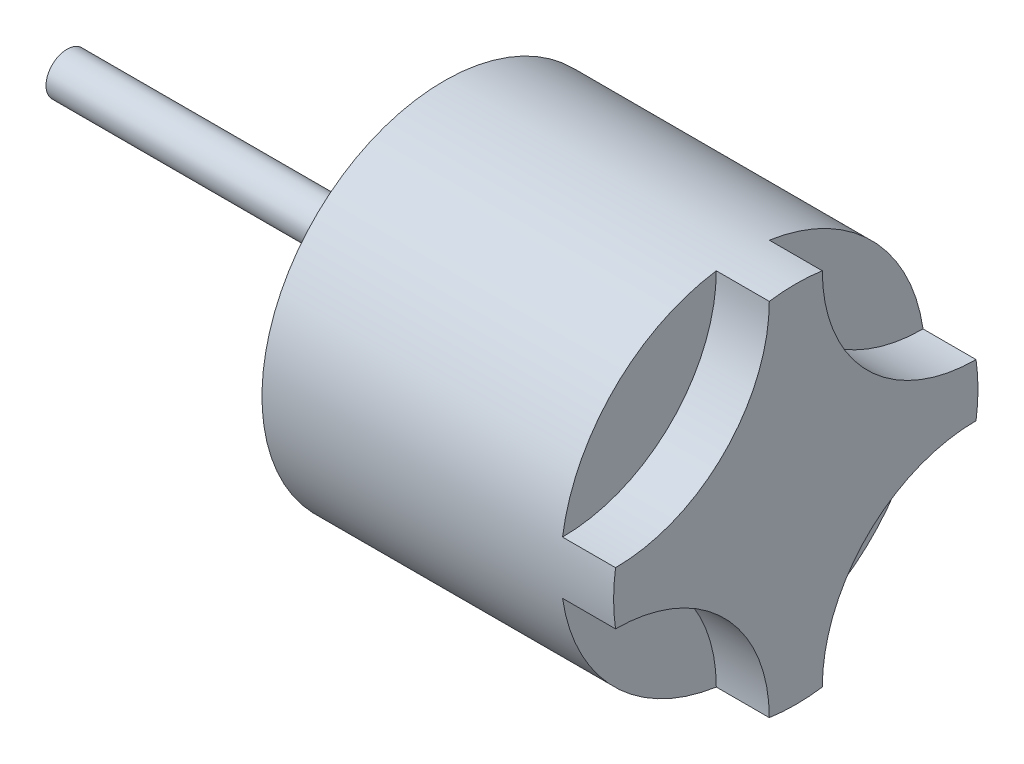
ISO-10303-21;
HEADER;
FILE_DESCRIPTION(('STEP AP214'),'2;1');
FILE_NAME('part.step','',(''),(''),'','','');
FILE_SCHEMA(('AUTOMOTIVE_DESIGN { 1 0 10303 214 1 1 1 1 }'));
ENDSEC;
DATA;
#1=APPLICATION_CONTEXT('core data for automotive mechanical design processes');
#2=APPLICATION_PROTOCOL_DEFINITION('international standard','automotive_design',2000,#1);
#3=PRODUCT_CONTEXT('',#1,'mechanical');
#4=PRODUCT('Part','Part','',(#3));
#5=PRODUCT_RELATED_PRODUCT_CATEGORY('part','',(#4));
#6=PRODUCT_DEFINITION_FORMATION('','',#4);
#7=PRODUCT_DEFINITION_CONTEXT('part definition',#1,'design');
#8=PRODUCT_DEFINITION('design','',#6,#7);
#9=PRODUCT_DEFINITION_SHAPE('','',#8);
#10=(LENGTH_UNIT() NAMED_UNIT(*) SI_UNIT(.MILLI.,.METRE.));
#11=(NAMED_UNIT(*) PLANE_ANGLE_UNIT() SI_UNIT($,.RADIAN.));
#12=(NAMED_UNIT(*) SI_UNIT($,.STERADIAN.) SOLID_ANGLE_UNIT());
#13=UNCERTAINTY_MEASURE_WITH_UNIT(LENGTH_MEASURE(1.E-05),#10,'distance_accuracy_value','');
#14=(GEOMETRIC_REPRESENTATION_CONTEXT(3) GLOBAL_UNCERTAINTY_ASSIGNED_CONTEXT((#13)) GLOBAL_UNIT_ASSIGNED_CONTEXT((#10,
#11,#12)) REPRESENTATION_CONTEXT('',''));
#15=CARTESIAN_POINT('',(0.,0.,0.));
#16=DIRECTION('',(0.,0.,1.));
#17=DIRECTION('',(1.,0.,0.));
#18=AXIS2_PLACEMENT_3D('',#15,#16,#17);
#19=CARTESIAN_POINT('',(30.,0.,0.));
#20=DIRECTION('',(-1.,0.,0.));
#21=DIRECTION('',(0.,0.,1.));
#22=AXIS2_PLACEMENT_3D('',#19,#20,#21);
#23=CYLINDRICAL_SURFACE('',#22,13.75);
#24=CARTESIAN_POINT('',(3.46410161513776,0.,0.));
#25=DIRECTION('',(1.,0.,0.));
#26=DIRECTION('',(0.,0.,-1.));
#27=AXIS2_PLACEMENT_3D('',#24,#25,#26);
#28=CIRCLE('',#27,13.75);
#29=CARTESIAN_POINT('',(3.46410161513776,0.,-13.75));
#30=VERTEX_POINT('',#29);
#31=EDGE_CURVE('E41',#30,#30,#28,.T.);
#32=ORIENTED_EDGE('',*,*,#31,.T.);
#33=EDGE_LOOP('',(#32));
#34=FACE_BOUND('',#33,.T.);
#35=DIRECTION('',(1.,0.,0.));
#36=VECTOR('',#35,1.);
#37=CARTESIAN_POINT('',(26.,-2.,13.6037678604128));
#38=LINE('',#37,#36);
#39=CARTESIAN_POINT('',(26.,-2.,13.6037678604128));
#40=VERTEX_POINT('',#39);
#41=CARTESIAN_POINT('',(30.,-2.,13.6037678604128));
#42=VERTEX_POINT('',#41);
#43=EDGE_CURVE('E102',#40,#42,#38,.T.);
#44=ORIENTED_EDGE('',*,*,#43,.T.);
#45=CARTESIAN_POINT('',(30.,0.,0.));
#46=DIRECTION('',(1.,0.,0.));
#47=DIRECTION('',(0.,0.,-1.));
#48=AXIS2_PLACEMENT_3D('',#45,#46,#47);
#49=CIRCLE('',#48,13.75);
#50=CARTESIAN_POINT('',(30.,2.,13.6037678604128));
#51=VERTEX_POINT('',#50);
#52=EDGE_CURVE('E158',#51,#42,#49,.T.);
#53=ORIENTED_EDGE('',*,*,#52,.F.);
#54=DIRECTION('',(1.,0.,0.));
#55=VECTOR('',#54,1.);
#56=CARTESIAN_POINT('',(26.,2.,13.6037678604128));
#57=LINE('',#56,#55);
#58=CARTESIAN_POINT('',(26.,2.,13.6037678604128));
#59=VERTEX_POINT('',#58);
#60=EDGE_CURVE('E147',#59,#51,#57,.T.);
#61=ORIENTED_EDGE('',*,*,#60,.F.);
#62=CARTESIAN_POINT('',(26.,0.,0.));
#63=DIRECTION('',(1.,0.,0.));
#64=DIRECTION('',(0.,0.,-1.));
#65=AXIS2_PLACEMENT_3D('',#62,#63,#64);
#66=CIRCLE('',#65,13.75);
#67=CARTESIAN_POINT('',(26.,13.6037678604128,2.));
#68=VERTEX_POINT('',#67);
#69=EDGE_CURVE('E142',#68,#59,#66,.T.);
#70=ORIENTED_EDGE('',*,*,#69,.F.);
#71=DIRECTION('',(1.,0.,0.));
#72=VECTOR('',#71,1.);
#73=CARTESIAN_POINT('',(26.,13.6037678604128,2.));
#74=LINE('',#73,#72);
#75=CARTESIAN_POINT('',(30.,13.6037678604128,2.));
#76=VERTEX_POINT('',#75);
#77=EDGE_CURVE('E150',#68,#76,#74,.T.);
#78=ORIENTED_EDGE('',*,*,#77,.T.);
#79=CARTESIAN_POINT('',(30.,13.6037678604128,-2.));
#80=VERTEX_POINT('',#79);
#81=EDGE_CURVE('E157',#80,#76,#49,.T.);
#82=ORIENTED_EDGE('',*,*,#81,.F.);
#83=DIRECTION('',(1.,0.,0.));
#84=VECTOR('',#83,1.);
#85=CARTESIAN_POINT('',(26.,13.6037678604128,-2.));
#86=LINE('',#85,#84);
#87=CARTESIAN_POINT('',(26.,13.6037678604128,-2.));
#88=VERTEX_POINT('',#87);
#89=EDGE_CURVE('E134',#88,#80,#86,.T.);
#90=ORIENTED_EDGE('',*,*,#89,.F.);
#91=CARTESIAN_POINT('',(26.,0.,0.));
#92=DIRECTION('',(-1.,0.,0.));
#93=DIRECTION('',(0.,0.,1.));
#94=AXIS2_PLACEMENT_3D('',#91,#92,#93);
#95=CIRCLE('',#94,13.75);
#96=CARTESIAN_POINT('',(26.,2.,-13.6037678604128));
#97=VERTEX_POINT('',#96);
#98=EDGE_CURVE('E129',#88,#97,#95,.T.);
#99=ORIENTED_EDGE('',*,*,#98,.T.);
#100=DIRECTION('',(1.,0.,0.));
#101=VECTOR('',#100,1.);
#102=CARTESIAN_POINT('',(26.,2.,-13.6037678604128));
#103=LINE('',#102,#101);
#104=CARTESIAN_POINT('',(30.,2.,-13.6037678604128));
#105=VERTEX_POINT('',#104);
#106=EDGE_CURVE('E137',#97,#105,#103,.T.);
#107=ORIENTED_EDGE('',*,*,#106,.T.);
#108=CARTESIAN_POINT('',(30.,-2.,-13.6037678604128));
#109=VERTEX_POINT('',#108);
#110=EDGE_CURVE('E300',#109,#105,#49,.T.);
#111=ORIENTED_EDGE('',*,*,#110,.F.);
#112=DIRECTION('',(1.,0.,0.));
#113=VECTOR('',#112,1.);
#114=CARTESIAN_POINT('',(26.,-2.,-13.6037678604128));
#115=LINE('',#114,#113);
#116=CARTESIAN_POINT('',(26.,-2.,-13.6037678604128));
#117=VERTEX_POINT('',#116);
#118=EDGE_CURVE('E56',#117,#109,#115,.T.);
#119=ORIENTED_EDGE('',*,*,#118,.F.);
#120=CARTESIAN_POINT('',(26.,0.,0.));
#121=DIRECTION('',(1.,0.,0.));
#122=DIRECTION('',(0.,0.,1.));
#123=AXIS2_PLACEMENT_3D('',#120,#121,#122);
#124=CIRCLE('',#123,13.75);
#125=CARTESIAN_POINT('',(26.,-13.6037678604128,-2.));
#126=VERTEX_POINT('',#125);
#127=EDGE_CURVE('E119',#126,#117,#124,.T.);
#128=ORIENTED_EDGE('',*,*,#127,.F.);
#129=DIRECTION('',(1.,0.,0.));
#130=VECTOR('',#129,1.);
#131=CARTESIAN_POINT('',(26.,-13.6037678604128,-2.));
#132=LINE('',#131,#130);
#133=CARTESIAN_POINT('',(30.,-13.6037678604128,-2.));
#134=VERTEX_POINT('',#133);
#135=EDGE_CURVE('E125',#126,#134,#132,.T.);
#136=ORIENTED_EDGE('',*,*,#135,.T.);
#137=CARTESIAN_POINT('',(30.,-13.6037678604128,2.));
#138=VERTEX_POINT('',#137);
#139=EDGE_CURVE('E113',#138,#134,#49,.T.);
#140=ORIENTED_EDGE('',*,*,#139,.F.);
#141=DIRECTION('',(1.,0.,0.));
#142=VECTOR('',#141,1.);
#143=CARTESIAN_POINT('',(26.,-13.6037678604128,2.));
#144=LINE('',#143,#142);
#145=CARTESIAN_POINT('',(26.,-13.6037678604128,2.));
#146=VERTEX_POINT('',#145);
#147=EDGE_CURVE('E48',#146,#138,#144,.T.);
#148=ORIENTED_EDGE('',*,*,#147,.F.);
#149=CARTESIAN_POINT('',(26.,0.,0.));
#150=DIRECTION('',(-1.,0.,0.));
#151=DIRECTION('',(0.,0.,-1.));
#152=AXIS2_PLACEMENT_3D('',#149,#150,#151);
#153=CIRCLE('',#152,13.75);
#154=EDGE_CURVE('E105',#146,#40,#153,.T.);
#155=ORIENTED_EDGE('',*,*,#154,.T.);
#156=EDGE_LOOP('',(#44,#53,#61,#70,#78,#82,#90,#99,#107,#111,#119,#128,#136,#140,#148,#155));
#157=FACE_BOUND('',#156,.T.);
#158=ADVANCED_FACE('F33',(#34,#157),#23,.T.);
#159=CARTESIAN_POINT('',(30.,0.,0.));
#160=DIRECTION('',(1.,0.,0.));
#161=DIRECTION('',(0.,0.,-1.));
#162=AXIS2_PLACEMENT_3D('',#159,#160,#161);
#163=PLANE('',#162);
#164=ORIENTED_EDGE('',*,*,#52,.T.);
#165=CARTESIAN_POINT('',(30.,-13.6037678604128,13.6037678604128));
#166=DIRECTION('',(-1.,0.,0.));
#167=DIRECTION('',(0.,0.,1.));
#168=AXIS2_PLACEMENT_3D('',#165,#166,#167);
#169=CIRCLE('',#168,11.6037678604128);
#170=EDGE_CURVE('E109',#42,#138,#169,.T.);
#171=ORIENTED_EDGE('',*,*,#170,.T.);
#172=ORIENTED_EDGE('',*,*,#139,.T.);
#173=CARTESIAN_POINT('',(30.,-13.6037678604128,-13.6037678604128));
#174=DIRECTION('',(1.,0.,0.));
#175=DIRECTION('',(0.,0.,-1.));
#176=AXIS2_PLACEMENT_3D('',#173,#174,#175);
#177=CIRCLE('',#176,11.6037678604128);
#178=EDGE_CURVE('E115',#109,#134,#177,.T.);
#179=ORIENTED_EDGE('',*,*,#178,.F.);
#180=ORIENTED_EDGE('',*,*,#110,.T.);
#181=CARTESIAN_POINT('',(30.,13.6037678604128,-13.6037678604128));
#182=DIRECTION('',(-1.,0.,0.));
#183=DIRECTION('',(0.,0.,-1.));
#184=AXIS2_PLACEMENT_3D('',#181,#182,#183);
#185=CIRCLE('',#184,11.6037678604128);
#186=EDGE_CURVE('E127',#105,#80,#185,.T.);
#187=ORIENTED_EDGE('',*,*,#186,.T.);
#188=ORIENTED_EDGE('',*,*,#81,.T.);
#189=CARTESIAN_POINT('',(30.,13.6037678604128,13.6037678604128));
#190=DIRECTION('',(1.,0.,0.));
#191=DIRECTION('',(0.,0.,1.));
#192=AXIS2_PLACEMENT_3D('',#189,#190,#191);
#193=CIRCLE('',#192,11.6037678604128);
#194=EDGE_CURVE('E140',#51,#76,#193,.T.);
#195=ORIENTED_EDGE('',*,*,#194,.F.);
#196=EDGE_LOOP('',(#164,#171,#172,#179,#180,#187,#188,#195));
#197=FACE_BOUND('',#196,.T.);
#198=ADVANCED_FACE('F183',(#197),#163,.T.);
#199=CARTESIAN_POINT('',(0.,0.,0.));
#200=DIRECTION('',(1.,0.,0.));
#201=DIRECTION('',(0.,0.,-1.));
#202=AXIS2_PLACEMENT_3D('',#199,#200,#201);
#203=PLANE('',#202);
#204=CARTESIAN_POINT('',(0.,0.,0.));
#205=DIRECTION('',(1.,0.,0.));
#206=DIRECTION('',(0.,0.,-1.));
#207=AXIS2_PLACEMENT_3D('',#204,#205,#206);
#208=CIRCLE('',#207,7.74999999999996);
#209=CARTESIAN_POINT('',(0.,0.,-7.74999999999996));
#210=VERTEX_POINT('',#209);
#211=EDGE_CURVE('E11',#210,#210,#208,.F.);
#212=ORIENTED_EDGE('',*,*,#211,.T.);
#213=EDGE_LOOP('',(#212));
#214=FACE_BOUND('',#213,.T.);
#215=CARTESIAN_POINT('',(0.,0.,0.));
#216=DIRECTION('',(1.,0.,0.));
#217=DIRECTION('',(0.,0.,-1.));
#218=AXIS2_PLACEMENT_3D('',#215,#216,#217);
#219=CIRCLE('',#218,1.585);
#220=CARTESIAN_POINT('',(0.,0.,-1.585));
#221=VERTEX_POINT('',#220);
#222=EDGE_CURVE('E161',#221,#221,#219,.F.);
#223=ORIENTED_EDGE('',*,*,#222,.F.);
#224=EDGE_LOOP('',(#223));
#225=FACE_BOUND('',#224,.T.);
#226=ADVANCED_FACE('F187',(#214,#225),#203,.F.);
#227=CARTESIAN_POINT('',(-25.,0.,0.));
#228=DIRECTION('',(1.,0.,0.));
#229=DIRECTION('',(0.,0.,-1.));
#230=AXIS2_PLACEMENT_3D('',#227,#228,#229);
#231=CYLINDRICAL_SURFACE('',#230,1.585);
#232=CARTESIAN_POINT('',(-25.,0.,0.));
#233=DIRECTION('',(-1.,0.,0.));
#234=DIRECTION('',(0.,0.,1.));
#235=AXIS2_PLACEMENT_3D('',#232,#233,#234);
#236=CIRCLE('',#235,1.585);
#237=CARTESIAN_POINT('',(-25.,0.,1.585));
#238=VERTEX_POINT('',#237);
#239=EDGE_CURVE('E153',#238,#238,#236,.T.);
#240=ORIENTED_EDGE('',*,*,#239,.F.);
#241=EDGE_LOOP('',(#240));
#242=FACE_BOUND('',#241,.T.);
#243=ORIENTED_EDGE('',*,*,#222,.T.);
#244=EDGE_LOOP('',(#243));
#245=FACE_BOUND('',#244,.T.);
#246=ADVANCED_FACE('F178',(#242,#245),#231,.T.);
#247=CARTESIAN_POINT('',(-25.,0.,0.));
#248=DIRECTION('',(-1.,0.,0.));
#249=DIRECTION('',(0.,0.,1.));
#250=AXIS2_PLACEMENT_3D('',#247,#248,#249);
#251=PLANE('',#250);
#252=ORIENTED_EDGE('',*,*,#239,.T.);
#253=EDGE_LOOP('',(#252));
#254=FACE_BOUND('',#253,.T.);
#255=ADVANCED_FACE('F169',(#254),#251,.T.);
#256=CARTESIAN_POINT('',(3.46410161513776,0.,0.));
#257=DIRECTION('',(1.,0.,0.));
#258=DIRECTION('',(0.,0.,-1.));
#259=AXIS2_PLACEMENT_3D('',#256,#257,#258);
#260=CONICAL_SURFACE('',#259,13.75,1.0471975511966);
#261=ORIENTED_EDGE('',*,*,#211,.F.);
#262=EDGE_LOOP('',(#261));
#263=FACE_BOUND('',#262,.T.);
#264=ORIENTED_EDGE('',*,*,#31,.F.);
#265=EDGE_LOOP('',(#264));
#266=FACE_BOUND('',#265,.T.);
#267=ADVANCED_FACE('F35',(#263,#266),#260,.T.);
#268=CARTESIAN_POINT('',(26.,13.6037678604128,13.6037678604128));
#269=DIRECTION('',(1.,0.,0.));
#270=DIRECTION('',(0.,0.,-1.));
#271=AXIS2_PLACEMENT_3D('',#268,#269,#270);
#272=CYLINDRICAL_SURFACE('',#271,11.6037678604128);
#273=ORIENTED_EDGE('',*,*,#194,.T.);
#274=ORIENTED_EDGE('',*,*,#77,.F.);
#275=CARTESIAN_POINT('',(26.,13.6037678604128,13.6037678604128));
#276=DIRECTION('',(1.,0.,0.));
#277=DIRECTION('',(0.,0.,1.));
#278=AXIS2_PLACEMENT_3D('',#275,#276,#277);
#279=CIRCLE('',#278,11.6037678604128);
#280=EDGE_CURVE('E144',#59,#68,#279,.T.);
#281=ORIENTED_EDGE('',*,*,#280,.F.);
#282=ORIENTED_EDGE('',*,*,#60,.T.);
#283=EDGE_LOOP('',(#273,#274,#281,#282));
#284=FACE_BOUND('',#283,.T.);
#285=ADVANCED_FACE('F168',(#284),#272,.F.);
#286=CARTESIAN_POINT('',(26.,6.8018839302064,6.8018839302064));
#287=DIRECTION('',(1.,0.,0.));
#288=DIRECTION('',(0.,0.,-1.));
#289=AXIS2_PLACEMENT_3D('',#286,#287,#288);
#290=PLANE('',#289);
#291=ORIENTED_EDGE('',*,*,#69,.T.);
#292=ORIENTED_EDGE('',*,*,#280,.T.);
#293=EDGE_LOOP('',(#291,#292));
#294=FACE_BOUND('',#293,.T.);
#295=ADVANCED_FACE('F175',(#294),#290,.T.);
#296=CARTESIAN_POINT('',(26.,13.6037678604128,-13.6037678604128));
#297=DIRECTION('',(1.,0.,0.));
#298=DIRECTION('',(0.,0.,-1.));
#299=AXIS2_PLACEMENT_3D('',#296,#297,#298);
#300=CYLINDRICAL_SURFACE('',#299,11.6037678604128);
#301=ORIENTED_EDGE('',*,*,#186,.F.);
#302=ORIENTED_EDGE('',*,*,#106,.F.);
#303=CARTESIAN_POINT('',(26.,13.6037678604128,-13.6037678604128));
#304=DIRECTION('',(-1.,0.,0.));
#305=DIRECTION('',(0.,0.,-1.));
#306=AXIS2_PLACEMENT_3D('',#303,#304,#305);
#307=CIRCLE('',#306,11.6037678604128);
#308=EDGE_CURVE('E132',#97,#88,#307,.T.);
#309=ORIENTED_EDGE('',*,*,#308,.T.);
#310=ORIENTED_EDGE('',*,*,#89,.T.);
#311=EDGE_LOOP('',(#301,#302,#309,#310));
#312=FACE_BOUND('',#311,.T.);
#313=ADVANCED_FACE('F199',(#312),#300,.F.);
#314=CARTESIAN_POINT('',(26.,6.8018839302064,-6.8018839302064));
#315=DIRECTION('',(1.,0.,0.));
#316=DIRECTION('',(0.,0.,1.));
#317=AXIS2_PLACEMENT_3D('',#314,#315,#316);
#318=PLANE('',#317);
#319=ORIENTED_EDGE('',*,*,#98,.F.);
#320=ORIENTED_EDGE('',*,*,#308,.F.);
#321=EDGE_LOOP('',(#319,#320));
#322=FACE_BOUND('',#321,.T.);
#323=ADVANCED_FACE('F203',(#322),#318,.T.);
#324=CARTESIAN_POINT('',(26.,-13.6037678604128,-13.6037678604128));
#325=DIRECTION('',(1.,0.,0.));
#326=DIRECTION('',(0.,0.,-1.));
#327=AXIS2_PLACEMENT_3D('',#324,#325,#326);
#328=CYLINDRICAL_SURFACE('',#327,11.6037678604128);
#329=ORIENTED_EDGE('',*,*,#178,.T.);
#330=ORIENTED_EDGE('',*,*,#135,.F.);
#331=CARTESIAN_POINT('',(26.,-13.6037678604128,-13.6037678604128));
#332=DIRECTION('',(1.,0.,0.));
#333=DIRECTION('',(0.,0.,-1.));
#334=AXIS2_PLACEMENT_3D('',#331,#332,#333);
#335=CIRCLE('',#334,11.6037678604128);
#336=EDGE_CURVE('E121',#117,#126,#335,.T.);
#337=ORIENTED_EDGE('',*,*,#336,.F.);
#338=ORIENTED_EDGE('',*,*,#118,.T.);
#339=EDGE_LOOP('',(#329,#330,#337,#338));
#340=FACE_BOUND('',#339,.T.);
#341=ADVANCED_FACE('F207',(#340),#328,.F.);
#342=CARTESIAN_POINT('',(26.,-6.8018839302064,-6.8018839302064));
#343=DIRECTION('',(1.,0.,0.));
#344=DIRECTION('',(0.,0.,1.));
#345=AXIS2_PLACEMENT_3D('',#342,#343,#344);
#346=PLANE('',#345);
#347=ORIENTED_EDGE('',*,*,#127,.T.);
#348=ORIENTED_EDGE('',*,*,#336,.T.);
#349=EDGE_LOOP('',(#347,#348));
#350=FACE_BOUND('',#349,.T.);
#351=ADVANCED_FACE('F211',(#350),#346,.T.);
#352=CARTESIAN_POINT('',(26.,-13.6037678604128,13.6037678604128));
#353=DIRECTION('',(1.,0.,0.));
#354=DIRECTION('',(0.,0.,-1.));
#355=AXIS2_PLACEMENT_3D('',#352,#353,#354);
#356=CYLINDRICAL_SURFACE('',#355,11.6037678604128);
#357=ORIENTED_EDGE('',*,*,#170,.F.);
#358=ORIENTED_EDGE('',*,*,#43,.F.);
#359=CARTESIAN_POINT('',(26.,-13.6037678604128,13.6037678604128));
#360=DIRECTION('',(-1.,0.,0.));
#361=DIRECTION('',(0.,0.,1.));
#362=AXIS2_PLACEMENT_3D('',#359,#360,#361);
#363=CIRCLE('',#362,11.6037678604128);
#364=EDGE_CURVE('E98',#40,#146,#363,.T.);
#365=ORIENTED_EDGE('',*,*,#364,.T.);
#366=ORIENTED_EDGE('',*,*,#147,.T.);
#367=EDGE_LOOP('',(#357,#358,#365,#366));
#368=FACE_BOUND('',#367,.T.);
#369=ADVANCED_FACE('F100',(#368),#356,.F.);
#370=CARTESIAN_POINT('',(26.,-6.8018839302064,6.8018839302064));
#371=DIRECTION('',(1.,0.,0.));
#372=DIRECTION('',(0.,0.,-1.));
#373=AXIS2_PLACEMENT_3D('',#370,#371,#372);
#374=PLANE('',#373);
#375=ORIENTED_EDGE('',*,*,#154,.F.);
#376=ORIENTED_EDGE('',*,*,#364,.F.);
#377=EDGE_LOOP('',(#375,#376));
#378=FACE_BOUND('',#377,.T.);
#379=ADVANCED_FACE('F107',(#378),#374,.T.);
#380=CLOSED_SHELL('',(#158,#198,#226,#246,#255,#267,#285,#295,#313,#323,#341,#351,#369,#379));
#381=MANIFOLD_SOLID_BREP('B2',#380);
#382=ADVANCED_BREP_SHAPE_REPRESENTATION('',(#18,#381),#14);
#383=SHAPE_DEFINITION_REPRESENTATION(#9,#382);
ENDSEC;
END-ISO-10303-21;
